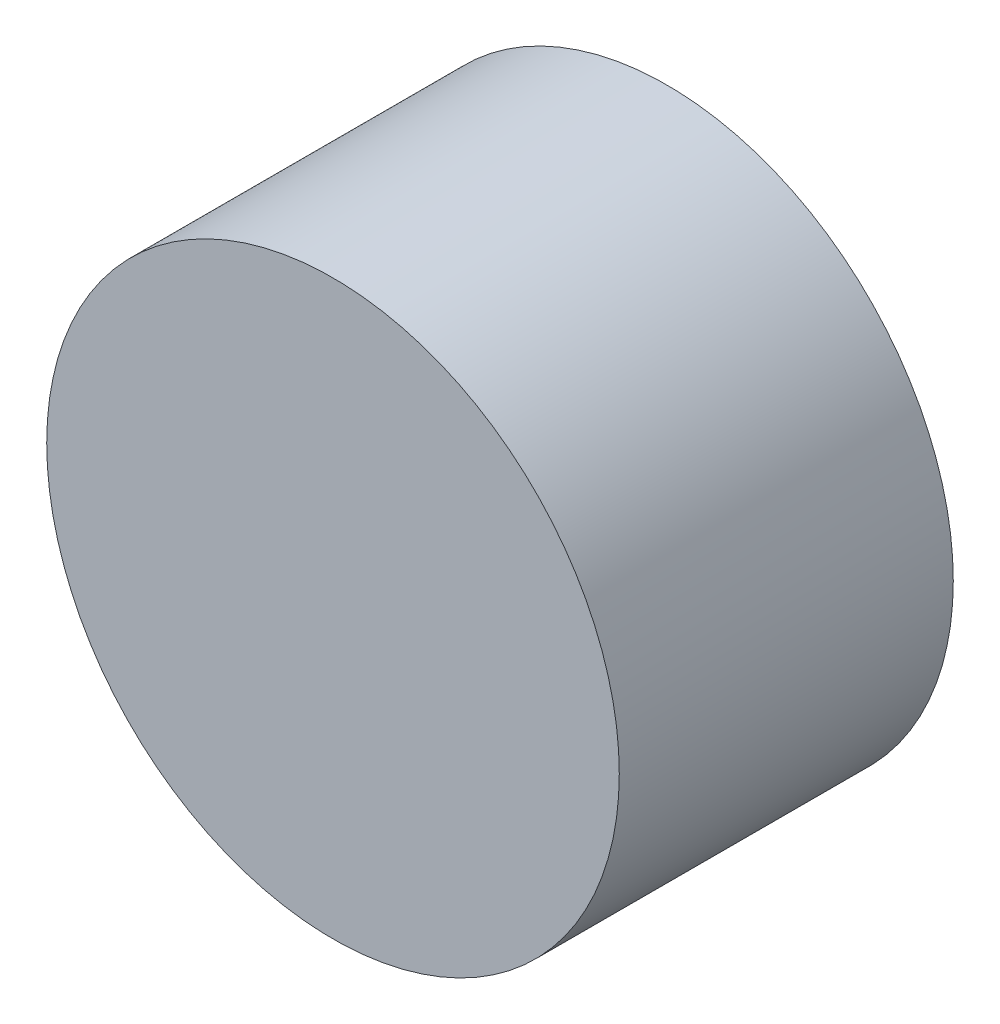
ISO-10303-21;
HEADER;
FILE_DESCRIPTION(('STEP AP214'),'2;1');
FILE_NAME('part.step','',(''),(''),'','','');
FILE_SCHEMA(('AUTOMOTIVE_DESIGN { 1 0 10303 214 1 1 1 1 }'));
ENDSEC;
DATA;
#1=APPLICATION_CONTEXT('core data for automotive mechanical design processes');
#2=APPLICATION_PROTOCOL_DEFINITION('international standard','automotive_design',2000,#1);
#3=PRODUCT_CONTEXT('',#1,'mechanical');
#4=PRODUCT('Part','Part','',(#3));
#5=PRODUCT_RELATED_PRODUCT_CATEGORY('part','',(#4));
#6=PRODUCT_DEFINITION_FORMATION('','',#4);
#7=PRODUCT_DEFINITION_CONTEXT('part definition',#1,'design');
#8=PRODUCT_DEFINITION('design','',#6,#7);
#9=PRODUCT_DEFINITION_SHAPE('','',#8);
#10=(LENGTH_UNIT() NAMED_UNIT(*) SI_UNIT(.MILLI.,.METRE.));
#11=(NAMED_UNIT(*) PLANE_ANGLE_UNIT() SI_UNIT($,.RADIAN.));
#12=(NAMED_UNIT(*) SI_UNIT($,.STERADIAN.) SOLID_ANGLE_UNIT());
#13=UNCERTAINTY_MEASURE_WITH_UNIT(LENGTH_MEASURE(1.E-05),#10,'distance_accuracy_value','');
#14=(GEOMETRIC_REPRESENTATION_CONTEXT(3) GLOBAL_UNCERTAINTY_ASSIGNED_CONTEXT((#13)) GLOBAL_UNIT_ASSIGNED_CONTEXT((#10,
#11,#12)) REPRESENTATION_CONTEXT('',''));
#15=CARTESIAN_POINT('',(0.,0.,0.));
#16=DIRECTION('',(0.,0.,1.));
#17=DIRECTION('',(1.,0.,0.));
#18=AXIS2_PLACEMENT_3D('',#15,#16,#17);
#19=CARTESIAN_POINT('',(0.,0.,280.));
#20=DIRECTION('',(0.,0.,-1.));
#21=DIRECTION('',(-1.,0.,0.));
#22=AXIS2_PLACEMENT_3D('',#19,#20,#21);
#23=CYLINDRICAL_SURFACE('',#22,240.);
#24=CARTESIAN_POINT('',(0.,0.,280.));
#25=DIRECTION('',(0.,0.,1.));
#26=DIRECTION('',(1.,0.,0.));
#27=AXIS2_PLACEMENT_3D('',#24,#25,#26);
#28=CIRCLE('',#27,240.);
#29=CARTESIAN_POINT('',(240.,0.,280.));
#30=VERTEX_POINT('',#29);
#31=EDGE_CURVE('E10',#30,#30,#28,.T.);
#32=ORIENTED_EDGE('',*,*,#31,.F.);
#33=EDGE_LOOP('',(#32));
#34=FACE_BOUND('',#33,.T.);
#35=CARTESIAN_POINT('',(0.,0.,0.));
#36=DIRECTION('',(0.,0.,1.));
#37=DIRECTION('',(1.,0.,0.));
#38=AXIS2_PLACEMENT_3D('',#35,#36,#37);
#39=CIRCLE('',#38,240.);
#40=CARTESIAN_POINT('',(240.,0.,0.));
#41=VERTEX_POINT('',#40);
#42=EDGE_CURVE('E46',#41,#41,#39,.T.);
#43=ORIENTED_EDGE('',*,*,#42,.T.);
#44=EDGE_LOOP('',(#43));
#45=FACE_BOUND('',#44,.T.);
#46=ADVANCED_FACE('F43',(#34,#45),#23,.T.);
#47=CARTESIAN_POINT('',(0.,0.,280.));
#48=DIRECTION('',(0.,0.,1.));
#49=DIRECTION('',(1.,0.,0.));
#50=AXIS2_PLACEMENT_3D('',#47,#48,#49);
#51=PLANE('',#50);
#52=ORIENTED_EDGE('',*,*,#31,.T.);
#53=EDGE_LOOP('',(#52));
#54=FACE_BOUND('',#53,.T.);
#55=ADVANCED_FACE('F60',(#54),#51,.T.);
#56=CARTESIAN_POINT('',(0.,0.,0.));
#57=DIRECTION('',(0.,0.,1.));
#58=DIRECTION('',(1.,0.,0.));
#59=AXIS2_PLACEMENT_3D('',#56,#57,#58);
#60=PLANE('',#59);
#61=ORIENTED_EDGE('',*,*,#42,.F.);
#62=EDGE_LOOP('',(#61));
#63=FACE_BOUND('',#62,.T.);
#64=ADVANCED_FACE('F58',(#63),#60,.F.);
#65=CLOSED_SHELL('',(#46,#55,#64));
#66=MANIFOLD_SOLID_BREP('B2',#65);
#67=ADVANCED_BREP_SHAPE_REPRESENTATION('',(#18,#66),#14);
#68=SHAPE_DEFINITION_REPRESENTATION(#9,#67);
ENDSEC;
END-ISO-10303-21;
